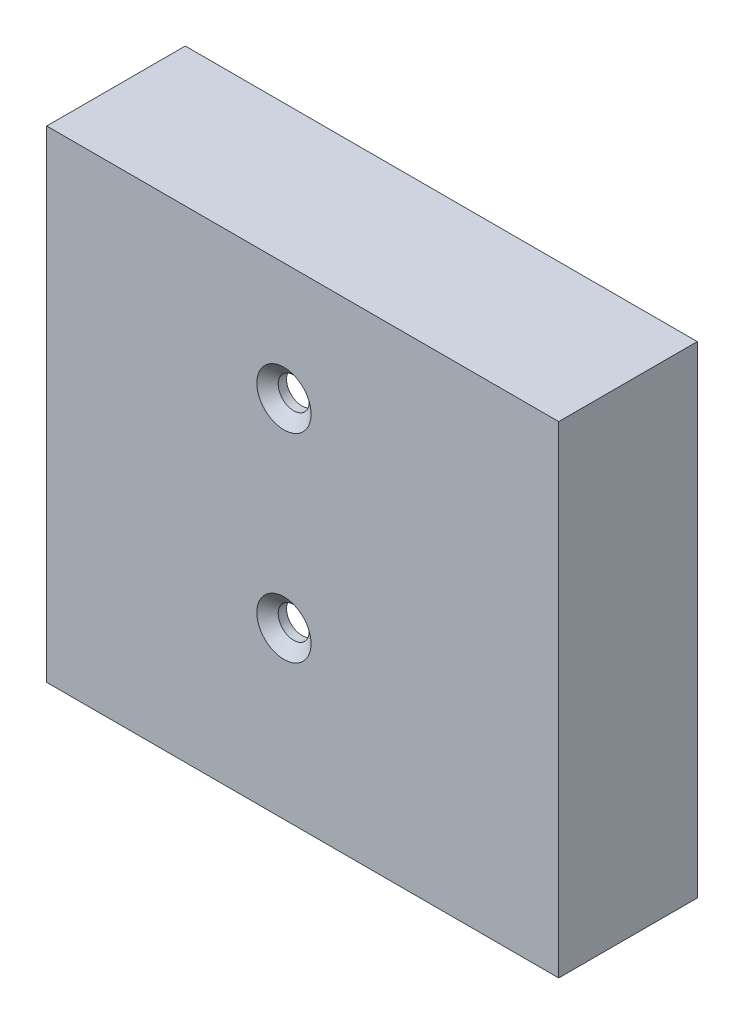
ISO-10303-21;
HEADER;
FILE_DESCRIPTION(('STEP AP214'),'2;1');
FILE_NAME('part.step','',(''),(''),'','','');
FILE_SCHEMA(('AUTOMOTIVE_DESIGN { 1 0 10303 214 1 1 1 1 }'));
ENDSEC;
DATA;
#1=APPLICATION_CONTEXT('core data for automotive mechanical design processes');
#2=APPLICATION_PROTOCOL_DEFINITION('international standard','automotive_design',2000,#1);
#3=PRODUCT_CONTEXT('',#1,'mechanical');
#4=PRODUCT('Part','Part','',(#3));
#5=PRODUCT_RELATED_PRODUCT_CATEGORY('part','',(#4));
#6=PRODUCT_DEFINITION_FORMATION('','',#4);
#7=PRODUCT_DEFINITION_CONTEXT('part definition',#1,'design');
#8=PRODUCT_DEFINITION('design','',#6,#7);
#9=PRODUCT_DEFINITION_SHAPE('','',#8);
#10=(LENGTH_UNIT() NAMED_UNIT(*) SI_UNIT(.MILLI.,.METRE.));
#11=(NAMED_UNIT(*) PLANE_ANGLE_UNIT() SI_UNIT($,.RADIAN.));
#12=(NAMED_UNIT(*) SI_UNIT($,.STERADIAN.) SOLID_ANGLE_UNIT());
#13=UNCERTAINTY_MEASURE_WITH_UNIT(LENGTH_MEASURE(1.E-05),#10,'distance_accuracy_value','');
#14=(GEOMETRIC_REPRESENTATION_CONTEXT(3) GLOBAL_UNCERTAINTY_ASSIGNED_CONTEXT((#13)) GLOBAL_UNIT_ASSIGNED_CONTEXT((#10,
#11,#12)) REPRESENTATION_CONTEXT('',''));
#15=CARTESIAN_POINT('',(0.,0.,0.));
#16=DIRECTION('',(0.,0.,1.));
#17=DIRECTION('',(1.,0.,0.));
#18=AXIS2_PLACEMENT_3D('',#15,#16,#17);
#19=CARTESIAN_POINT('',(-1.5875,0.,-14.2875));
#20=DIRECTION('',(0.,0.,-1.));
#21=DIRECTION('',(-1.,0.,0.));
#22=AXIS2_PLACEMENT_3D('',#19,#20,#21);
#23=PLANE('',#22);
#24=DIRECTION('',(1.,0.,0.));
#25=VECTOR('',#24,1.);
#26=CARTESIAN_POINT('',(-1.5885,43.815,-14.2875));
#27=LINE('',#26,#25);
#28=CARTESIAN_POINT('',(0.,43.815,-14.2875));
#29=VERTEX_POINT('',#28);
#30=CARTESIAN_POINT('',(1.27,43.815,-14.2875));
#31=VERTEX_POINT('',#30);
#32=EDGE_CURVE('E499',#29,#31,#27,.T.);
#33=ORIENTED_EDGE('',*,*,#32,.T.);
#34=DIRECTION('',(0.,-1.,0.));
#35=VECTOR('',#34,1.);
#36=CARTESIAN_POINT('',(1.27,48.26,-14.2875));
#37=LINE('',#36,#35);
#38=CARTESIAN_POINT('',(1.27,27.94,-14.2875));
#39=VERTEX_POINT('',#38);
#40=EDGE_CURVE('E291',#31,#39,#37,.T.);
#41=ORIENTED_EDGE('',*,*,#40,.T.);
#42=DIRECTION('',(1.,0.,0.));
#43=VECTOR('',#42,1.);
#44=CARTESIAN_POINT('',(-1.5885,27.94,-14.2875));
#45=LINE('',#44,#43);
#46=CARTESIAN_POINT('',(0.,27.94,-14.2875));
#47=VERTEX_POINT('',#46);
#48=EDGE_CURVE('E66',#47,#39,#45,.T.);
#49=ORIENTED_EDGE('',*,*,#48,.F.);
#50=DIRECTION('',(0.,-1.,0.));
#51=VECTOR('',#50,1.);
#52=CARTESIAN_POINT('',(0.,48.26,-14.2875));
#53=LINE('',#52,#51);
#54=EDGE_CURVE('E275',#29,#47,#53,.T.);
#55=ORIENTED_EDGE('',*,*,#54,.F.);
#56=EDGE_LOOP('',(#33,#41,#49,#55));
#57=FACE_BOUND('',#56,.T.);
#58=ADVANCED_FACE('F40',(#57),#23,.T.);
#59=DIRECTION('',(1.,0.,0.));
#60=VECTOR('',#59,1.);
#61=CARTESIAN_POINT('',(-1.5885,14.605,-14.2875));
#62=LINE('',#61,#60);
#63=CARTESIAN_POINT('',(0.,14.605,-14.2875));
#64=VERTEX_POINT('',#63);
#65=CARTESIAN_POINT('',(1.27,14.605,-14.2875));
#66=VERTEX_POINT('',#65);
#67=EDGE_CURVE('E250',#64,#66,#62,.T.);
#68=ORIENTED_EDGE('',*,*,#67,.F.);
#69=CARTESIAN_POINT('',(0.,22.86,-14.2875));
#70=VERTEX_POINT('',#69);
#71=EDGE_CURVE('E265',#70,#64,#53,.T.);
#72=ORIENTED_EDGE('',*,*,#71,.F.);
#73=DIRECTION('',(1.,0.,0.));
#74=VECTOR('',#73,1.);
#75=CARTESIAN_POINT('',(-1.5885,22.86,-14.2875));
#76=LINE('',#75,#74);
#77=CARTESIAN_POINT('',(1.27,22.86,-14.2875));
#78=VERTEX_POINT('',#77);
#79=EDGE_CURVE('E521',#70,#78,#76,.T.);
#80=ORIENTED_EDGE('',*,*,#79,.T.);
#81=EDGE_CURVE('E267',#78,#66,#37,.T.);
#82=ORIENTED_EDGE('',*,*,#81,.T.);
#83=EDGE_LOOP('',(#68,#72,#80,#82));
#84=FACE_BOUND('',#83,.T.);
#85=ADVANCED_FACE('F263',(#84),#23,.T.);
#86=DIRECTION('',(1.,0.,0.));
#87=VECTOR('',#86,1.);
#88=CARTESIAN_POINT('',(-1.5885,9.52500000000001,-14.2875));
#89=LINE('',#88,#87);
#90=CARTESIAN_POINT('',(0.,9.52500000000001,-14.2875));
#91=VERTEX_POINT('',#90);
#92=CARTESIAN_POINT('',(1.27,9.52500000000001,-14.2875));
#93=VERTEX_POINT('',#92);
#94=EDGE_CURVE('E269',#91,#93,#89,.T.);
#95=ORIENTED_EDGE('',*,*,#94,.T.);
#96=CARTESIAN_POINT('',(1.27,6.858,-14.2875));
#97=VERTEX_POINT('',#96);
#98=EDGE_CURVE('E287',#93,#97,#37,.T.);
#99=ORIENTED_EDGE('',*,*,#98,.T.);
#100=DIRECTION('',(1.,0.,0.));
#101=VECTOR('',#100,1.);
#102=CARTESIAN_POINT('',(0.,6.858,-14.2875));
#103=LINE('',#102,#101);
#104=CARTESIAN_POINT('',(0.,6.858,-14.2875));
#105=VERTEX_POINT('',#104);
#106=EDGE_CURVE('E292',#105,#97,#103,.T.);
#107=ORIENTED_EDGE('',*,*,#106,.F.);
#108=EDGE_CURVE('E276',#91,#105,#53,.T.);
#109=ORIENTED_EDGE('',*,*,#108,.F.);
#110=EDGE_LOOP('',(#95,#99,#107,#109));
#111=FACE_BOUND('',#110,.T.);
#112=ADVANCED_FACE('F660',(#111),#23,.T.);
#113=CARTESIAN_POINT('',(0.,48.26,-57.2964739477001));
#114=DIRECTION('',(-1.,0.,0.));
#115=DIRECTION('',(0.,-1.,0.));
#116=AXIS2_PLACEMENT_3D('',#113,#114,#115);
#117=PLANE('',#116);
#118=DIRECTION('',(0.,0.,1.));
#119=VECTOR('',#118,1.);
#120=CARTESIAN_POINT('',(0.,14.605,-12.7));
#121=LINE('',#120,#119);
#122=CARTESIAN_POINT('',(0.,14.605,-12.7));
#123=VERTEX_POINT('',#122);
#124=EDGE_CURVE('E246',#64,#123,#121,.T.);
#125=ORIENTED_EDGE('',*,*,#124,.T.);
#126=DIRECTION('',(0.,1.,0.));
#127=VECTOR('',#126,1.);
#128=CARTESIAN_POINT('',(0.,0.,-12.7));
#129=LINE('',#128,#127);
#130=CARTESIAN_POINT('',(0.,22.86,-12.7));
#131=VERTEX_POINT('',#130);
#132=EDGE_CURVE('E309',#123,#131,#129,.T.);
#133=ORIENTED_EDGE('',*,*,#132,.T.);
#134=DIRECTION('',(0.,0.,-1.));
#135=VECTOR('',#134,1.);
#136=CARTESIAN_POINT('',(0.,22.86,-14.2875));
#137=LINE('',#136,#135);
#138=EDGE_CURVE('E273',#131,#70,#137,.T.);
#139=ORIENTED_EDGE('',*,*,#138,.T.);
#140=ORIENTED_EDGE('',*,*,#71,.T.);
#141=EDGE_LOOP('',(#125,#133,#139,#140));
#142=FACE_BOUND('',#141,.T.);
#143=ADVANCED_FACE('F272',(#142),#117,.T.);
#144=DIRECTION('',(0.,0.,-1.));
#145=VECTOR('',#144,1.);
#146=CARTESIAN_POINT('',(0.,9.52500000000001,-12.7));
#147=LINE('',#146,#145);
#148=CARTESIAN_POINT('',(0.,9.52500000000001,-12.7));
#149=VERTEX_POINT('',#148);
#150=EDGE_CURVE('E475',#149,#91,#147,.T.);
#151=ORIENTED_EDGE('',*,*,#150,.T.);
#152=ORIENTED_EDGE('',*,*,#108,.T.);
#153=DIRECTION('',(0.,0.,1.));
#154=VECTOR('',#153,1.);
#155=CARTESIAN_POINT('',(0.,6.858,-57.2964739477001));
#156=LINE('',#155,#154);
#157=CARTESIAN_POINT('',(0.,6.858,-12.7));
#158=VERTEX_POINT('',#157);
#159=EDGE_CURVE('E297',#105,#158,#156,.T.);
#160=ORIENTED_EDGE('',*,*,#159,.T.);
#161=EDGE_CURVE('E304',#158,#149,#129,.T.);
#162=ORIENTED_EDGE('',*,*,#161,.T.);
#163=EDGE_LOOP('',(#151,#152,#160,#162));
#164=FACE_BOUND('',#163,.T.);
#165=ADVANCED_FACE('F665',(#164),#117,.T.);
#166=CARTESIAN_POINT('',(-1.5875,0.,-12.7));
#167=DIRECTION('',(0.,0.,-1.));
#168=DIRECTION('',(-1.,0.,0.));
#169=AXIS2_PLACEMENT_3D('',#166,#167,#168);
#170=PLANE('',#169);
#171=DIRECTION('',(1.,0.,0.));
#172=VECTOR('',#171,1.);
#173=CARTESIAN_POINT('',(0.,48.895,-12.7));
#174=LINE('',#173,#172);
#175=CARTESIAN_POINT('',(1.27,48.895,-12.7));
#176=VERTEX_POINT('',#175);
#177=CARTESIAN_POINT('',(50.4825,48.895,-12.7));
#178=VERTEX_POINT('',#177);
#179=EDGE_CURVE('E536',#176,#178,#174,.T.);
#180=ORIENTED_EDGE('',*,*,#179,.F.);
#181=DIRECTION('',(0.,-1.,0.));
#182=VECTOR('',#181,1.);
#183=CARTESIAN_POINT('',(1.27,48.895,-12.7));
#184=LINE('',#183,#182);
#185=CARTESIAN_POINT('',(1.27,48.26,-12.7));
#186=VERTEX_POINT('',#185);
#187=EDGE_CURVE('E453',#176,#186,#184,.T.);
#188=ORIENTED_EDGE('',*,*,#187,.T.);
#189=CARTESIAN_POINT('',(1.27,43.815,-12.7));
#190=VERTEX_POINT('',#189);
#191=EDGE_CURVE('E447',#186,#190,#184,.T.);
#192=ORIENTED_EDGE('',*,*,#191,.T.);
#193=DIRECTION('',(1.,0.,0.));
#194=VECTOR('',#193,1.);
#195=CARTESIAN_POINT('',(-1.5885,43.815,-12.7));
#196=LINE('',#195,#194);
#197=CARTESIAN_POINT('',(0.,43.815,-12.7));
#198=VERTEX_POINT('',#197);
#199=EDGE_CURVE('E498',#198,#190,#196,.T.);
#200=ORIENTED_EDGE('',*,*,#199,.F.);
#201=CARTESIAN_POINT('',(0.,27.94,-12.7));
#202=VERTEX_POINT('',#201);
#203=EDGE_CURVE('E310',#202,#198,#129,.T.);
#204=ORIENTED_EDGE('',*,*,#203,.F.);
#205=DIRECTION('',(1.,0.,0.));
#206=VECTOR('',#205,1.);
#207=CARTESIAN_POINT('',(-1.5885,27.94,-12.7));
#208=LINE('',#207,#206);
#209=CARTESIAN_POINT('',(1.27,27.94,-12.7));
#210=VERTEX_POINT('',#209);
#211=EDGE_CURVE('E528',#202,#210,#208,.T.);
#212=ORIENTED_EDGE('',*,*,#211,.T.);
#213=DIRECTION('',(0.,-1.,0.));
#214=VECTOR('',#213,1.);
#215=CARTESIAN_POINT('',(1.27,27.94,-12.7));
#216=LINE('',#215,#214);
#217=CARTESIAN_POINT('',(1.27,22.86,-12.7));
#218=VERTEX_POINT('',#217);
#219=EDGE_CURVE('E514',#210,#218,#216,.T.);
#220=ORIENTED_EDGE('',*,*,#219,.T.);
#221=DIRECTION('',(1.,0.,0.));
#222=VECTOR('',#221,1.);
#223=CARTESIAN_POINT('',(-1.5885,22.86,-12.7));
#224=LINE('',#223,#222);
#225=EDGE_CURVE('E525',#131,#218,#224,.T.);
#226=ORIENTED_EDGE('',*,*,#225,.F.);
#227=ORIENTED_EDGE('',*,*,#132,.F.);
#228=DIRECTION('',(1.,0.,0.));
#229=VECTOR('',#228,1.);
#230=CARTESIAN_POINT('',(-1.5885,14.605,-12.7));
#231=LINE('',#230,#229);
#232=CARTESIAN_POINT('',(1.27,14.605,-12.7));
#233=VERTEX_POINT('',#232);
#234=EDGE_CURVE('E252',#123,#233,#231,.T.);
#235=ORIENTED_EDGE('',*,*,#234,.T.);
#236=DIRECTION('',(0.,-1.,0.));
#237=VECTOR('',#236,1.);
#238=CARTESIAN_POINT('',(1.27,14.605,-12.7));
#239=LINE('',#238,#237);
#240=CARTESIAN_POINT('',(1.27,9.52500000000001,-12.7));
#241=VERTEX_POINT('',#240);
#242=EDGE_CURVE('E58',#233,#241,#239,.T.);
#243=ORIENTED_EDGE('',*,*,#242,.T.);
#244=DIRECTION('',(1.,0.,0.));
#245=VECTOR('',#244,1.);
#246=CARTESIAN_POINT('',(-1.5885,9.52500000000001,-12.7));
#247=LINE('',#246,#245);
#248=EDGE_CURVE('E473',#149,#241,#247,.T.);
#249=ORIENTED_EDGE('',*,*,#248,.F.);
#250=ORIENTED_EDGE('',*,*,#161,.F.);
#251=DIRECTION('',(0.,1.,0.));
#252=VECTOR('',#251,1.);
#253=CARTESIAN_POINT('',(0.,0.,-12.7));
#254=LINE('',#253,#252);
#255=CARTESIAN_POINT('',(0.,0.,-12.7));
#256=VERTEX_POINT('',#255);
#257=EDGE_CURVE('E392',#256,#158,#254,.T.);
#258=ORIENTED_EDGE('',*,*,#257,.F.);
#259=DIRECTION('',(1.,0.,0.));
#260=VECTOR('',#259,1.);
#261=CARTESIAN_POINT('',(-1.5875,0.,-12.7));
#262=LINE('',#261,#260);
#263=CARTESIAN_POINT('',(-1.5875,0.,-12.7));
#264=VERTEX_POINT('',#263);
#265=EDGE_CURVE('E418',#264,#256,#262,.T.);
#266=ORIENTED_EDGE('',*,*,#265,.F.);
#267=DIRECTION('',(0.,1.,0.));
#268=VECTOR('',#267,1.);
#269=CARTESIAN_POINT('',(-1.5875,0.,-12.7));
#270=LINE('',#269,#268);
#271=CARTESIAN_POINT('',(-1.5875,50.8,-12.7));
#272=VERTEX_POINT('',#271);
#273=EDGE_CURVE('E406',#264,#272,#270,.T.);
#274=ORIENTED_EDGE('',*,*,#273,.T.);
#275=DIRECTION('',(1.,0.,0.));
#276=VECTOR('',#275,1.);
#277=CARTESIAN_POINT('',(-1.5875,50.8,-12.7));
#278=LINE('',#277,#276);
#279=CARTESIAN_POINT('',(52.3875,50.8,-12.7));
#280=VERTEX_POINT('',#279);
#281=EDGE_CURVE('E422',#272,#280,#278,.T.);
#282=ORIENTED_EDGE('',*,*,#281,.T.);
#283=DIRECTION('',(0.,-1.,0.));
#284=VECTOR('',#283,1.);
#285=CARTESIAN_POINT('',(52.3875,50.8,-12.7));
#286=LINE('',#285,#284);
#287=CARTESIAN_POINT('',(52.3875,0.,-12.7));
#288=VERTEX_POINT('',#287);
#289=EDGE_CURVE('E380',#280,#288,#286,.T.);
#290=ORIENTED_EDGE('',*,*,#289,.T.);
#291=CARTESIAN_POINT('',(24.257,0.,-12.7));
#292=VERTEX_POINT('',#291);
#293=EDGE_CURVE('E414',#292,#288,#262,.T.);
#294=ORIENTED_EDGE('',*,*,#293,.F.);
#295=DIRECTION('',(0.,-1.,0.));
#296=VECTOR('',#295,1.);
#297=CARTESIAN_POINT('',(24.257,50.801,-12.7));
#298=LINE('',#297,#296);
#299=CARTESIAN_POINT('',(24.257,1.905,-12.7));
#300=VERTEX_POINT('',#299);
#301=EDGE_CURVE('E355',#300,#292,#298,.T.);
#302=ORIENTED_EDGE('',*,*,#301,.F.);
#303=DIRECTION('',(-1.,0.,0.));
#304=VECTOR('',#303,1.);
#305=CARTESIAN_POINT('',(50.4825,1.905,-12.7));
#306=LINE('',#305,#304);
#307=CARTESIAN_POINT('',(50.4825,1.905,-12.7));
#308=VERTEX_POINT('',#307);
#309=EDGE_CURVE('E537',#308,#300,#306,.T.);
#310=ORIENTED_EDGE('',*,*,#309,.F.);
#311=DIRECTION('',(0.,-1.,0.));
#312=VECTOR('',#311,1.);
#313=CARTESIAN_POINT('',(50.4825,48.895,-12.7));
#314=LINE('',#313,#312);
#315=EDGE_CURVE('E543',#178,#308,#314,.T.);
#316=ORIENTED_EDGE('',*,*,#315,.F.);
#317=EDGE_LOOP('',(#180,#188,#192,#200,#204,#212,#220,#226,#227,#235,#243,#249,#250,#258,#266,
#274,#282,#290,#294,#302,#310,#316));
#318=FACE_BOUND('',#317,.T.);
#319=ADVANCED_FACE('F606',(#318),#170,.T.);
#320=CARTESIAN_POINT('',(49.8475,48.26,-85.6732153344636));
#321=DIRECTION('',(0.,1.,0.));
#322=DIRECTION('',(0.,0.,1.));
#323=AXIS2_PLACEMENT_3D('',#320,#321,#322);
#324=PLANE('',#323);
#325=DIRECTION('',(0.,0.,1.));
#326=VECTOR('',#325,1.);
#327=CARTESIAN_POINT('',(1.27,48.26,-85.6732153344636));
#328=LINE('',#327,#326);
#329=CARTESIAN_POINT('',(1.27,48.26,-14.2875));
#330=VERTEX_POINT('',#329);
#331=EDGE_CURVE('E12',#330,#186,#328,.T.);
#332=ORIENTED_EDGE('',*,*,#331,.F.);
#333=DIRECTION('',(-1.,0.,0.));
#334=VECTOR('',#333,1.);
#335=CARTESIAN_POINT('',(49.8475,48.26,-14.2875));
#336=LINE('',#335,#334);
#337=CARTESIAN_POINT('',(49.8475,48.26,-14.2875));
#338=VERTEX_POINT('',#337);
#339=EDGE_CURVE('E568',#338,#330,#336,.T.);
#340=ORIENTED_EDGE('',*,*,#339,.F.);
#341=DIRECTION('',(0.,0.,1.));
#342=VECTOR('',#341,1.);
#343=CARTESIAN_POINT('',(49.8475,48.26,-85.6732153344636));
#344=LINE('',#343,#342);
#345=CARTESIAN_POINT('',(49.8475,48.26,0.));
#346=VERTEX_POINT('',#345);
#347=EDGE_CURVE('E381',#338,#346,#344,.T.);
#348=ORIENTED_EDGE('',*,*,#347,.T.);
#349=DIRECTION('',(-1.,0.,0.));
#350=VECTOR('',#349,1.);
#351=CARTESIAN_POINT('',(49.8475,48.26,0.));
#352=LINE('',#351,#350);
#353=CARTESIAN_POINT('',(1.27,48.26,0.));
#354=VERTEX_POINT('',#353);
#355=EDGE_CURVE('E376',#346,#354,#352,.T.);
#356=ORIENTED_EDGE('',*,*,#355,.T.);
#357=EDGE_CURVE('E50',#186,#354,#328,.T.);
#358=ORIENTED_EDGE('',*,*,#357,.F.);
#359=EDGE_LOOP('',(#332,#340,#348,#356,#358));
#360=FACE_BOUND('',#359,.T.);
#361=ADVANCED_FACE('F620',(#360),#324,.F.);
#362=CARTESIAN_POINT('',(0.,0.,0.));
#363=DIRECTION('',(0.,0.,-1.));
#364=DIRECTION('',(-1.,0.,0.));
#365=AXIS2_PLACEMENT_3D('',#362,#363,#364);
#366=PLANE('',#365);
#367=CARTESIAN_POINT('',(23.4188,38.4175,0.));
#368=DIRECTION('',(0.,0.,-1.));
#369=DIRECTION('',(-1.,0.,0.));
#370=AXIS2_PLACEMENT_3D('',#367,#368,#369);
#371=CIRCLE('',#370,1.63195);
#372=CARTESIAN_POINT('',(21.78685,38.4175,0.));
#373=VERTEX_POINT('',#372);
#374=EDGE_CURVE('E44',#373,#373,#371,.T.);
#375=ORIENTED_EDGE('',*,*,#374,.F.);
#376=EDGE_LOOP('',(#375));
#377=FACE_BOUND('',#376,.T.);
#378=CARTESIAN_POINT('',(23.4188,17.4625,0.));
#379=DIRECTION('',(0.,0.,-1.));
#380=DIRECTION('',(-1.,0.,0.));
#381=AXIS2_PLACEMENT_3D('',#378,#379,#380);
#382=CIRCLE('',#381,1.63195);
#383=CARTESIAN_POINT('',(21.78685,17.4625,0.));
#384=VERTEX_POINT('',#383);
#385=EDGE_CURVE('E444',#384,#384,#382,.T.);
#386=ORIENTED_EDGE('',*,*,#385,.F.);
#387=EDGE_LOOP('',(#386));
#388=FACE_BOUND('',#387,.T.);
#389=DIRECTION('',(1.,0.,0.));
#390=VECTOR('',#389,1.);
#391=CARTESIAN_POINT('',(0.,6.858,0.));
#392=LINE('',#391,#390);
#393=CARTESIAN_POINT('',(0.,6.858,0.));
#394=VERTEX_POINT('',#393);
#395=CARTESIAN_POINT('',(1.27,6.858,0.));
#396=VERTEX_POINT('',#395);
#397=EDGE_CURVE('E282',#394,#396,#392,.T.);
#398=ORIENTED_EDGE('',*,*,#397,.T.);
#399=DIRECTION('',(0.,-1.,0.));
#400=VECTOR('',#399,1.);
#401=CARTESIAN_POINT('',(1.27,48.26,0.));
#402=LINE('',#401,#400);
#403=EDGE_CURVE('E285',#354,#396,#402,.T.);
#404=ORIENTED_EDGE('',*,*,#403,.F.);
#405=ORIENTED_EDGE('',*,*,#355,.F.);
#406=DIRECTION('',(0.,1.,0.));
#407=VECTOR('',#406,1.);
#408=CARTESIAN_POINT('',(49.8475,2.53999999999999,0.));
#409=LINE('',#408,#407);
#410=CARTESIAN_POINT('',(49.8475,2.53999999999999,0.));
#411=VERTEX_POINT('',#410);
#412=EDGE_CURVE('E382',#411,#346,#409,.T.);
#413=ORIENTED_EDGE('',*,*,#412,.F.);
#414=DIRECTION('',(1.,0.,0.));
#415=VECTOR('',#414,1.);
#416=CARTESIAN_POINT('',(0.,2.54,0.));
#417=LINE('',#416,#415);
#418=CARTESIAN_POINT('',(24.257,2.53999999999999,0.));
#419=VERTEX_POINT('',#418);
#420=EDGE_CURVE('E375',#419,#411,#417,.T.);
#421=ORIENTED_EDGE('',*,*,#420,.F.);
#422=DIRECTION('',(0.,-1.,0.));
#423=VECTOR('',#422,1.);
#424=CARTESIAN_POINT('',(24.257,50.801,0.));
#425=LINE('',#424,#423);
#426=CARTESIAN_POINT('',(24.257,0.,0.));
#427=VERTEX_POINT('',#426);
#428=EDGE_CURVE('E360',#419,#427,#425,.T.);
#429=ORIENTED_EDGE('',*,*,#428,.T.);
#430=DIRECTION('',(-1.,0.,0.));
#431=VECTOR('',#430,1.);
#432=CARTESIAN_POINT('',(17.145,0.,0.));
#433=LINE('',#432,#431);
#434=CARTESIAN_POINT('',(17.145,0.,0.));
#435=VERTEX_POINT('',#434);
#436=EDGE_CURVE('E344',#427,#435,#433,.T.);
#437=ORIENTED_EDGE('',*,*,#436,.T.);
#438=DIRECTION('',(0.,-1.,0.));
#439=VECTOR('',#438,1.);
#440=CARTESIAN_POINT('',(17.145,50.801,0.));
#441=LINE('',#440,#439);
#442=CARTESIAN_POINT('',(17.145,5.08,0.));
#443=VERTEX_POINT('',#442);
#444=EDGE_CURVE('E320',#443,#435,#441,.T.);
#445=ORIENTED_EDGE('',*,*,#444,.F.);
#446=DIRECTION('',(1.,0.,0.));
#447=VECTOR('',#446,1.);
#448=CARTESIAN_POINT('',(17.145,5.08,0.));
#449=LINE('',#448,#447);
#450=CARTESIAN_POINT('',(6.985,5.08,0.));
#451=VERTEX_POINT('',#450);
#452=EDGE_CURVE('E311',#451,#443,#449,.T.);
#453=ORIENTED_EDGE('',*,*,#452,.F.);
#454=DIRECTION('',(0.,-1.,0.));
#455=VECTOR('',#454,1.);
#456=CARTESIAN_POINT('',(6.985,50.801,0.));
#457=LINE('',#456,#455);
#458=CARTESIAN_POINT('',(6.985,0.,0.));
#459=VERTEX_POINT('',#458);
#460=EDGE_CURVE('E339',#451,#459,#457,.T.);
#461=ORIENTED_EDGE('',*,*,#460,.T.);
#462=DIRECTION('',(-1.,0.,0.));
#463=VECTOR('',#462,1.);
#464=CARTESIAN_POINT('',(6.985,0.,0.));
#465=LINE('',#464,#463);
#466=CARTESIAN_POINT('',(0.,0.,0.));
#467=VERTEX_POINT('',#466);
#468=EDGE_CURVE('E332',#459,#467,#465,.T.);
#469=ORIENTED_EDGE('',*,*,#468,.T.);
#470=DIRECTION('',(0.,-1.,0.));
#471=VECTOR('',#470,1.);
#472=CARTESIAN_POINT('',(0.,0.,0.));
#473=LINE('',#472,#471);
#474=EDGE_CURVE('E426',#394,#467,#473,.T.);
#475=ORIENTED_EDGE('',*,*,#474,.F.);
#476=EDGE_LOOP('',(#398,#404,#405,#413,#421,#429,#437,#445,#453,#461,#469,#475));
#477=FACE_BOUND('',#476,.T.);
#478=ADVANCED_FACE('F614',(#377,#388,#477),#366,.T.);
#479=CARTESIAN_POINT('',(0.,0.,1.905));
#480=DIRECTION('',(0.,1.,0.));
#481=DIRECTION('',(0.,0.,1.));
#482=AXIS2_PLACEMENT_3D('',#479,#480,#481);
#483=PLANE('',#482);
#484=ORIENTED_EDGE('',*,*,#468,.F.);
#485=DIRECTION('',(0.,0.,1.));
#486=VECTOR('',#485,1.);
#487=CARTESIAN_POINT('',(6.985,0.,-12.7));
#488=LINE('',#487,#486);
#489=CARTESIAN_POINT('',(6.985,0.,-8.8392));
#490=VERTEX_POINT('',#489);
#491=EDGE_CURVE('E336',#490,#459,#488,.T.);
#492=ORIENTED_EDGE('',*,*,#491,.F.);
#493=DIRECTION('',(1.,0.,0.));
#494=VECTOR('',#493,1.);
#495=CARTESIAN_POINT('',(6.985,0.,-8.8392));
#496=LINE('',#495,#494);
#497=CARTESIAN_POINT('',(17.145,0.,-8.8392));
#498=VERTEX_POINT('',#497);
#499=EDGE_CURVE('E331',#490,#498,#496,.T.);
#500=ORIENTED_EDGE('',*,*,#499,.T.);
#501=DIRECTION('',(0.,0.,-1.));
#502=VECTOR('',#501,1.);
#503=CARTESIAN_POINT('',(17.145,0.,-12.7));
#504=LINE('',#503,#502);
#505=EDGE_CURVE('E352',#435,#498,#504,.T.);
#506=ORIENTED_EDGE('',*,*,#505,.F.);
#507=ORIENTED_EDGE('',*,*,#436,.F.);
#508=DIRECTION('',(0.,0.,1.));
#509=VECTOR('',#508,1.);
#510=CARTESIAN_POINT('',(24.257,0.,-12.7));
#511=LINE('',#510,#509);
#512=EDGE_CURVE('E348',#292,#427,#511,.T.);
#513=ORIENTED_EDGE('',*,*,#512,.F.);
#514=ORIENTED_EDGE('',*,*,#293,.T.);
#515=DIRECTION('',(0.,0.,-1.));
#516=VECTOR('',#515,1.);
#517=CARTESIAN_POINT('',(52.3875,0.,1.905));
#518=LINE('',#517,#516);
#519=CARTESIAN_POINT('',(52.3875,0.,1.905));
#520=VERTEX_POINT('',#519);
#521=EDGE_CURVE('E441',#520,#288,#518,.T.);
#522=ORIENTED_EDGE('',*,*,#521,.F.);
#523=DIRECTION('',(1.,0.,0.));
#524=VECTOR('',#523,1.);
#525=CARTESIAN_POINT('',(0.,0.,1.905));
#526=LINE('',#525,#524);
#527=CARTESIAN_POINT('',(-1.5875,0.,1.905));
#528=VERTEX_POINT('',#527);
#529=EDGE_CURVE('E427',#528,#520,#526,.T.);
#530=ORIENTED_EDGE('',*,*,#529,.F.);
#531=DIRECTION('',(0.,0.,-1.));
#532=VECTOR('',#531,1.);
#533=CARTESIAN_POINT('',(-1.5875,0.,1.905));
#534=LINE('',#533,#532);
#535=EDGE_CURVE('E410',#528,#264,#534,.T.);
#536=ORIENTED_EDGE('',*,*,#535,.T.);
#537=ORIENTED_EDGE('',*,*,#265,.T.);
#538=DIRECTION('',(0.,0.,-1.));
#539=VECTOR('',#538,1.);
#540=CARTESIAN_POINT('',(0.,0.,-12.7));
#541=LINE('',#540,#539);
#542=EDGE_CURVE('E327',#467,#256,#541,.T.);
#543=ORIENTED_EDGE('',*,*,#542,.F.);
#544=EDGE_LOOP('',(#484,#492,#500,#506,#507,#513,#514,#522,#530,#536,#537,#543));
#545=FACE_BOUND('',#544,.T.);
#546=ADVANCED_FACE('F42',(#545),#483,.F.);
#547=CARTESIAN_POINT('',(0.,2.54,-85.6732153344636));
#548=DIRECTION('',(0.,-1.,0.));
#549=DIRECTION('',(1.,0.,0.));
#550=AXIS2_PLACEMENT_3D('',#547,#548,#549);
#551=PLANE('',#550);
#552=DIRECTION('',(0.,0.,1.));
#553=VECTOR('',#552,1.);
#554=CARTESIAN_POINT('',(49.8475,2.53999999999999,-85.6732153344636));
#555=LINE('',#554,#553);
#556=CARTESIAN_POINT('',(49.8475,2.53999999999999,-14.2875));
#557=VERTEX_POINT('',#556);
#558=EDGE_CURVE('E386',#557,#411,#555,.T.);
#559=ORIENTED_EDGE('',*,*,#558,.F.);
#560=DIRECTION('',(1.,0.,0.));
#561=VECTOR('',#560,1.);
#562=CARTESIAN_POINT('',(24.257,2.53999999999999,-14.2875));
#563=LINE('',#562,#561);
#564=CARTESIAN_POINT('',(24.257,2.53999999999999,-14.2875));
#565=VERTEX_POINT('',#564);
#566=EDGE_CURVE('E290',#565,#557,#563,.T.);
#567=ORIENTED_EDGE('',*,*,#566,.F.);
#568=DIRECTION('',(0.,0.,-1.));
#569=VECTOR('',#568,1.);
#570=CARTESIAN_POINT('',(24.257,2.54,-12.7));
#571=LINE('',#570,#569);
#572=EDGE_CURVE('E343',#419,#565,#571,.T.);
#573=ORIENTED_EDGE('',*,*,#572,.F.);
#574=ORIENTED_EDGE('',*,*,#420,.T.);
#575=EDGE_LOOP('',(#559,#567,#573,#574));
#576=FACE_BOUND('',#575,.T.);
#577=ADVANCED_FACE('F626',(#576),#551,.F.);
#578=CARTESIAN_POINT('',(0.,0.,0.));
#579=DIRECTION('',(-1.,0.,0.));
#580=DIRECTION('',(0.,0.,1.));
#581=AXIS2_PLACEMENT_3D('',#578,#579,#580);
#582=PLANE('',#581);
#583=ORIENTED_EDGE('',*,*,#257,.T.);
#584=EDGE_CURVE('E281',#158,#394,#156,.T.);
#585=ORIENTED_EDGE('',*,*,#584,.T.);
#586=ORIENTED_EDGE('',*,*,#474,.T.);
#587=ORIENTED_EDGE('',*,*,#542,.T.);
#588=EDGE_LOOP('',(#583,#585,#586,#587));
#589=FACE_BOUND('',#588,.T.);
#590=ADVANCED_FACE('F652',(#589),#582,.F.);
#591=CARTESIAN_POINT('',(52.3875,0.,1.905));
#592=DIRECTION('',(-1.,0.,0.));
#593=DIRECTION('',(0.,0.,1.));
#594=AXIS2_PLACEMENT_3D('',#591,#592,#593);
#595=PLANE('',#594);
#596=ORIENTED_EDGE('',*,*,#521,.T.);
#597=ORIENTED_EDGE('',*,*,#289,.F.);
#598=DIRECTION('',(0.,0.,-1.));
#599=VECTOR('',#598,1.);
#600=CARTESIAN_POINT('',(52.3875,50.8,1.905));
#601=LINE('',#600,#599);
#602=CARTESIAN_POINT('',(52.3875,50.8,1.905));
#603=VERTEX_POINT('',#602);
#604=EDGE_CURVE('E436',#603,#280,#601,.T.);
#605=ORIENTED_EDGE('',*,*,#604,.F.);
#606=DIRECTION('',(0.,1.,0.));
#607=VECTOR('',#606,1.);
#608=CARTESIAN_POINT('',(52.3875,0.,1.905));
#609=LINE('',#608,#607);
#610=EDGE_CURVE('E430',#520,#603,#609,.T.);
#611=ORIENTED_EDGE('',*,*,#610,.F.);
#612=EDGE_LOOP('',(#596,#597,#605,#611));
#613=FACE_BOUND('',#612,.T.);
#614=ADVANCED_FACE('F1023',(#613),#595,.F.);
#615=CARTESIAN_POINT('',(0.,50.8,1.905));
#616=DIRECTION('',(0.,-1.,0.));
#617=DIRECTION('',(0.,0.,-1.));
#618=AXIS2_PLACEMENT_3D('',#615,#616,#617);
#619=PLANE('',#618);
#620=ORIENTED_EDGE('',*,*,#604,.T.);
#621=ORIENTED_EDGE('',*,*,#281,.F.);
#622=DIRECTION('',(0.,0.,-1.));
#623=VECTOR('',#622,1.);
#624=CARTESIAN_POINT('',(-1.5875,50.8,1.905));
#625=LINE('',#624,#623);
#626=CARTESIAN_POINT('',(-1.5875,50.8,1.905));
#627=VERTEX_POINT('',#626);
#628=EDGE_CURVE('E403',#627,#272,#625,.T.);
#629=ORIENTED_EDGE('',*,*,#628,.F.);
#630=DIRECTION('',(-1.,0.,0.));
#631=VECTOR('',#630,1.);
#632=CARTESIAN_POINT('',(0.,50.8,1.905));
#633=LINE('',#632,#631);
#634=EDGE_CURVE('E433',#603,#627,#633,.T.);
#635=ORIENTED_EDGE('',*,*,#634,.F.);
#636=EDGE_LOOP('',(#620,#621,#629,#635));
#637=FACE_BOUND('',#636,.T.);
#638=ADVANCED_FACE('F841',(#637),#619,.F.);
#639=CARTESIAN_POINT('',(0.,0.,1.905));
#640=DIRECTION('',(0.,0.,-1.));
#641=DIRECTION('',(-1.,0.,0.));
#642=AXIS2_PLACEMENT_3D('',#639,#640,#641);
#643=PLANE('',#642);
#644=CARTESIAN_POINT('',(23.4188,38.4175,1.905));
#645=DIRECTION('',(0.,0.,1.));
#646=DIRECTION('',(1.,0.,0.));
#647=AXIS2_PLACEMENT_3D('',#644,#645,#646);
#648=CIRCLE('',#647,2.8575);
#649=CARTESIAN_POINT('',(26.2763,38.4175,1.905));
#650=VERTEX_POINT('',#649);
#651=EDGE_CURVE('E1099',#650,#650,#648,.T.);
#652=ORIENTED_EDGE('',*,*,#651,.F.);
#653=EDGE_LOOP('',(#652));
#654=FACE_BOUND('',#653,.T.);
#655=CARTESIAN_POINT('',(23.4188,17.4625,1.905));
#656=DIRECTION('',(0.,0.,1.));
#657=DIRECTION('',(1.,0.,0.));
#658=AXIS2_PLACEMENT_3D('',#655,#656,#657);
#659=CIRCLE('',#658,2.8575);
#660=CARTESIAN_POINT('',(26.2763,17.4625,1.905));
#661=VERTEX_POINT('',#660);
#662=EDGE_CURVE('E456',#661,#661,#659,.T.);
#663=ORIENTED_EDGE('',*,*,#662,.F.);
#664=EDGE_LOOP('',(#663));
#665=FACE_BOUND('',#664,.T.);
#666=ORIENTED_EDGE('',*,*,#634,.T.);
#667=DIRECTION('',(0.,1.,0.));
#668=VECTOR('',#667,1.);
#669=CARTESIAN_POINT('',(-1.5875,0.,1.905));
#670=LINE('',#669,#668);
#671=EDGE_CURVE('E399',#528,#627,#670,.T.);
#672=ORIENTED_EDGE('',*,*,#671,.F.);
#673=ORIENTED_EDGE('',*,*,#529,.T.);
#674=ORIENTED_EDGE('',*,*,#610,.T.);
#675=EDGE_LOOP('',(#666,#672,#673,#674));
#676=FACE_BOUND('',#675,.T.);
#677=ADVANCED_FACE('F835',(#654,#665,#676),#643,.F.);
#678=CARTESIAN_POINT('',(-1.5875,0.,0.));
#679=DIRECTION('',(-1.,0.,0.));
#680=DIRECTION('',(0.,0.,1.));
#681=AXIS2_PLACEMENT_3D('',#678,#679,#680);
#682=PLANE('',#681);
#683=ORIENTED_EDGE('',*,*,#671,.T.);
#684=ORIENTED_EDGE('',*,*,#628,.T.);
#685=ORIENTED_EDGE('',*,*,#273,.F.);
#686=ORIENTED_EDGE('',*,*,#535,.F.);
#687=EDGE_LOOP('',(#683,#684,#685,#686));
#688=FACE_BOUND('',#687,.T.);
#689=ADVANCED_FACE('F840',(#688),#682,.T.);
#690=CARTESIAN_POINT('',(49.8475,2.53999999999999,-85.6732153344636));
#691=DIRECTION('',(1.,0.,0.));
#692=DIRECTION('',(0.,0.,-1.));
#693=AXIS2_PLACEMENT_3D('',#690,#691,#692);
#694=PLANE('',#693);
#695=ORIENTED_EDGE('',*,*,#347,.F.);
#696=DIRECTION('',(0.,1.,0.));
#697=VECTOR('',#696,1.);
#698=CARTESIAN_POINT('',(49.8475,2.53999999999999,-14.2875));
#699=LINE('',#698,#697);
#700=EDGE_CURVE('E572',#557,#338,#699,.T.);
#701=ORIENTED_EDGE('',*,*,#700,.F.);
#702=ORIENTED_EDGE('',*,*,#558,.T.);
#703=ORIENTED_EDGE('',*,*,#412,.T.);
#704=EDGE_LOOP('',(#695,#701,#702,#703));
#705=FACE_BOUND('',#704,.T.);
#706=ADVANCED_FACE('F623',(#705),#694,.F.);
#707=CARTESIAN_POINT('',(6.985,50.801,-8.8392));
#708=DIRECTION('',(0.,0.,-1.));
#709=DIRECTION('',(-1.,0.,0.));
#710=AXIS2_PLACEMENT_3D('',#707,#708,#709);
#711=PLANE('',#710);
#712=DIRECTION('',(0.,-1.,0.));
#713=VECTOR('',#712,1.);
#714=CARTESIAN_POINT('',(17.145,50.801,-8.8392));
#715=LINE('',#714,#713);
#716=CARTESIAN_POINT('',(17.145,5.08,-8.8392));
#717=VERTEX_POINT('',#716);
#718=EDGE_CURVE('E368',#717,#498,#715,.T.);
#719=ORIENTED_EDGE('',*,*,#718,.T.);
#720=ORIENTED_EDGE('',*,*,#499,.F.);
#721=DIRECTION('',(0.,-1.,0.));
#722=VECTOR('',#721,1.);
#723=CARTESIAN_POINT('',(6.985,50.801,-8.8392));
#724=LINE('',#723,#722);
#725=CARTESIAN_POINT('',(6.985,5.08,-8.8392));
#726=VERTEX_POINT('',#725);
#727=EDGE_CURVE('E372',#726,#490,#724,.T.);
#728=ORIENTED_EDGE('',*,*,#727,.F.);
#729=DIRECTION('',(1.,0.,0.));
#730=VECTOR('',#729,1.);
#731=CARTESIAN_POINT('',(17.145,5.08,-8.8392));
#732=LINE('',#731,#730);
#733=EDGE_CURVE('E315',#726,#717,#732,.T.);
#734=ORIENTED_EDGE('',*,*,#733,.T.);
#735=EDGE_LOOP('',(#719,#720,#728,#734));
#736=FACE_BOUND('',#735,.T.);
#737=ADVANCED_FACE('F643',(#736),#711,.T.);
#738=CARTESIAN_POINT('',(17.145,50.801,-12.7));
#739=DIRECTION('',(-1.,0.,0.));
#740=DIRECTION('',(0.,0.,1.));
#741=AXIS2_PLACEMENT_3D('',#738,#739,#740);
#742=PLANE('',#741);
#743=ORIENTED_EDGE('',*,*,#718,.F.);
#744=DIRECTION('',(0.,0.,1.));
#745=VECTOR('',#744,1.);
#746=CARTESIAN_POINT('',(17.145,5.08,-19.3118882890689));
#747=LINE('',#746,#745);
#748=EDGE_CURVE('E308',#717,#443,#747,.T.);
#749=ORIENTED_EDGE('',*,*,#748,.T.);
#750=ORIENTED_EDGE('',*,*,#444,.T.);
#751=ORIENTED_EDGE('',*,*,#505,.T.);
#752=EDGE_LOOP('',(#743,#749,#750,#751));
#753=FACE_BOUND('',#752,.T.);
#754=ADVANCED_FACE('F640',(#753),#742,.F.);
#755=CARTESIAN_POINT('',(24.257,50.801,-12.7));
#756=DIRECTION('',(1.,0.,0.));
#757=DIRECTION('',(0.,0.,-1.));
#758=AXIS2_PLACEMENT_3D('',#755,#756,#757);
#759=PLANE('',#758);
#760=ORIENTED_EDGE('',*,*,#572,.T.);
#761=DIRECTION('',(0.,1.,0.));
#762=VECTOR('',#761,1.);
#763=CARTESIAN_POINT('',(24.257,1.905,-14.2875));
#764=LINE('',#763,#762);
#765=CARTESIAN_POINT('',(24.257,1.905,-14.2875));
#766=VERTEX_POINT('',#765);
#767=EDGE_CURVE('E553',#766,#565,#764,.T.);
#768=ORIENTED_EDGE('',*,*,#767,.F.);
#769=DIRECTION('',(0.,0.,1.));
#770=VECTOR('',#769,1.);
#771=CARTESIAN_POINT('',(24.257,1.905,-83.2551946566289));
#772=LINE('',#771,#770);
#773=EDGE_CURVE('E541',#766,#300,#772,.T.);
#774=ORIENTED_EDGE('',*,*,#773,.T.);
#775=ORIENTED_EDGE('',*,*,#301,.T.);
#776=ORIENTED_EDGE('',*,*,#512,.T.);
#777=ORIENTED_EDGE('',*,*,#428,.F.);
#778=EDGE_LOOP('',(#760,#768,#774,#775,#776,#777));
#779=FACE_BOUND('',#778,.T.);
#780=ADVANCED_FACE('F632',(#779),#759,.F.);
#781=CARTESIAN_POINT('',(6.985,50.801,-12.7));
#782=DIRECTION('',(1.,0.,0.));
#783=DIRECTION('',(0.,0.,-1.));
#784=AXIS2_PLACEMENT_3D('',#781,#782,#783);
#785=PLANE('',#784);
#786=ORIENTED_EDGE('',*,*,#727,.T.);
#787=ORIENTED_EDGE('',*,*,#491,.T.);
#788=ORIENTED_EDGE('',*,*,#460,.F.);
#789=DIRECTION('',(0.,0.,1.));
#790=VECTOR('',#789,1.);
#791=CARTESIAN_POINT('',(6.985,5.08,-19.3118882890689));
#792=LINE('',#791,#790);
#793=EDGE_CURVE('E316',#726,#451,#792,.T.);
#794=ORIENTED_EDGE('',*,*,#793,.F.);
#795=EDGE_LOOP('',(#786,#787,#788,#794));
#796=FACE_BOUND('',#795,.T.);
#797=ADVANCED_FACE('F687',(#796),#785,.F.);
#798=CARTESIAN_POINT('',(17.145,5.08,-19.3118882890689));
#799=DIRECTION('',(0.,-1.,0.));
#800=DIRECTION('',(0.,0.,-1.));
#801=AXIS2_PLACEMENT_3D('',#798,#799,#800);
#802=PLANE('',#801);
#803=ORIENTED_EDGE('',*,*,#733,.F.);
#804=ORIENTED_EDGE('',*,*,#793,.T.);
#805=ORIENTED_EDGE('',*,*,#452,.T.);
#806=ORIENTED_EDGE('',*,*,#748,.F.);
#807=EDGE_LOOP('',(#803,#804,#805,#806));
#808=FACE_BOUND('',#807,.T.);
#809=ADVANCED_FACE('F647',(#808),#802,.F.);
#810=DIRECTION('',(0.,1.,0.));
#811=VECTOR('',#810,1.);
#812=CARTESIAN_POINT('',(1.27,48.895,-14.2875));
#813=LINE('',#812,#811);
#814=CARTESIAN_POINT('',(1.27,48.895,-14.2875));
#815=VERTEX_POINT('',#814);
#816=EDGE_CURVE('E490',#330,#815,#813,.T.);
#817=ORIENTED_EDGE('',*,*,#816,.T.);
#818=DIRECTION('',(1.,0.,0.));
#819=VECTOR('',#818,1.);
#820=CARTESIAN_POINT('',(0.,48.895,-14.2875));
#821=LINE('',#820,#819);
#822=CARTESIAN_POINT('',(50.4825,48.895,-14.2875));
#823=VERTEX_POINT('',#822);
#824=EDGE_CURVE('E565',#815,#823,#821,.T.);
#825=ORIENTED_EDGE('',*,*,#824,.T.);
#826=DIRECTION('',(0.,-1.,0.));
#827=VECTOR('',#826,1.);
#828=CARTESIAN_POINT('',(50.4825,48.895,-14.2875));
#829=LINE('',#828,#827);
#830=CARTESIAN_POINT('',(50.4825,1.905,-14.2875));
#831=VERTEX_POINT('',#830);
#832=EDGE_CURVE('E561',#823,#831,#829,.T.);
#833=ORIENTED_EDGE('',*,*,#832,.T.);
#834=DIRECTION('',(-1.,0.,0.));
#835=VECTOR('',#834,1.);
#836=CARTESIAN_POINT('',(50.4825,1.905,-14.2875));
#837=LINE('',#836,#835);
#838=EDGE_CURVE('E557',#831,#766,#837,.T.);
#839=ORIENTED_EDGE('',*,*,#838,.T.);
#840=ORIENTED_EDGE('',*,*,#767,.T.);
#841=ORIENTED_EDGE('',*,*,#566,.T.);
#842=ORIENTED_EDGE('',*,*,#700,.T.);
#843=ORIENTED_EDGE('',*,*,#339,.T.);
#844=EDGE_LOOP('',(#817,#825,#833,#839,#840,#841,#842,#843));
#845=FACE_BOUND('',#844,.T.);
#846=ADVANCED_FACE('F676',(#845),#23,.T.);
#847=DIRECTION('',(0.,0.,-1.));
#848=VECTOR('',#847,1.);
#849=CARTESIAN_POINT('',(0.,43.815,-12.7));
#850=LINE('',#849,#848);
#851=EDGE_CURVE('E258',#198,#29,#850,.T.);
#852=ORIENTED_EDGE('',*,*,#851,.T.);
#853=ORIENTED_EDGE('',*,*,#54,.T.);
#854=DIRECTION('',(0.,0.,1.));
#855=VECTOR('',#854,1.);
#856=CARTESIAN_POINT('',(0.,27.94,-14.2875));
#857=LINE('',#856,#855);
#858=EDGE_CURVE('E524',#47,#202,#857,.T.);
#859=ORIENTED_EDGE('',*,*,#858,.T.);
#860=ORIENTED_EDGE('',*,*,#203,.T.);
#861=EDGE_LOOP('',(#852,#853,#859,#860));
#862=FACE_BOUND('',#861,.T.);
#863=ADVANCED_FACE('F603',(#862),#117,.T.);
#864=CARTESIAN_POINT('',(0.,6.858,-57.2964739477001));
#865=DIRECTION('',(0.,-1.,0.));
#866=DIRECTION('',(1.,0.,0.));
#867=AXIS2_PLACEMENT_3D('',#864,#865,#866);
#868=PLANE('',#867);
#869=ORIENTED_EDGE('',*,*,#159,.F.);
#870=ORIENTED_EDGE('',*,*,#106,.T.);
#871=DIRECTION('',(0.,0.,1.));
#872=VECTOR('',#871,1.);
#873=CARTESIAN_POINT('',(1.27,6.858,-57.2964739477001));
#874=LINE('',#873,#872);
#875=EDGE_CURVE('E296',#97,#396,#874,.T.);
#876=ORIENTED_EDGE('',*,*,#875,.T.);
#877=ORIENTED_EDGE('',*,*,#397,.F.);
#878=ORIENTED_EDGE('',*,*,#584,.F.);
#879=EDGE_LOOP('',(#869,#870,#876,#877,#878));
#880=FACE_BOUND('',#879,.T.);
#881=ADVANCED_FACE('F656',(#880),#868,.T.);
#882=CARTESIAN_POINT('',(1.27,48.26,-57.2964739477001));
#883=DIRECTION('',(-1.,0.,0.));
#884=DIRECTION('',(0.,-1.,0.));
#885=AXIS2_PLACEMENT_3D('',#882,#883,#884);
#886=PLANE('',#885);
#887=DIRECTION('',(0.,0.,-1.));
#888=VECTOR('',#887,1.);
#889=CARTESIAN_POINT('',(1.27,43.815,-12.7));
#890=LINE('',#889,#888);
#891=EDGE_CURVE('E487',#190,#31,#890,.T.);
#892=ORIENTED_EDGE('',*,*,#891,.F.);
#893=ORIENTED_EDGE('',*,*,#191,.F.);
#894=ORIENTED_EDGE('',*,*,#357,.T.);
#895=ORIENTED_EDGE('',*,*,#403,.T.);
#896=ORIENTED_EDGE('',*,*,#875,.F.);
#897=ORIENTED_EDGE('',*,*,#98,.F.);
#898=DIRECTION('',(0.,0.,-1.));
#899=VECTOR('',#898,1.);
#900=CARTESIAN_POINT('',(1.27,9.52500000000001,-12.7));
#901=LINE('',#900,#899);
#902=EDGE_CURVE('E467',#241,#93,#901,.T.);
#903=ORIENTED_EDGE('',*,*,#902,.F.);
#904=ORIENTED_EDGE('',*,*,#242,.F.);
#905=DIRECTION('',(0.,0.,1.));
#906=VECTOR('',#905,1.);
#907=CARTESIAN_POINT('',(1.27,14.605,-12.7));
#908=LINE('',#907,#906);
#909=EDGE_CURVE('E470',#66,#233,#908,.T.);
#910=ORIENTED_EDGE('',*,*,#909,.F.);
#911=ORIENTED_EDGE('',*,*,#81,.F.);
#912=DIRECTION('',(0.,0.,-1.));
#913=VECTOR('',#912,1.);
#914=CARTESIAN_POINT('',(1.27,22.86,-14.2875));
#915=LINE('',#914,#913);
#916=EDGE_CURVE('E518',#218,#78,#915,.T.);
#917=ORIENTED_EDGE('',*,*,#916,.F.);
#918=ORIENTED_EDGE('',*,*,#219,.F.);
#919=DIRECTION('',(0.,0.,1.));
#920=VECTOR('',#919,1.);
#921=CARTESIAN_POINT('',(1.27,27.94,-14.2875));
#922=LINE('',#921,#920);
#923=EDGE_CURVE('E511',#39,#210,#922,.T.);
#924=ORIENTED_EDGE('',*,*,#923,.F.);
#925=ORIENTED_EDGE('',*,*,#40,.F.);
#926=EDGE_LOOP('',(#892,#893,#894,#895,#896,#897,#903,#904,#910,#911,#917,#918,#924,#925));
#927=FACE_BOUND('',#926,.T.);
#928=ADVANCED_FACE('F595',(#927),#886,.F.);
#929=CARTESIAN_POINT('',(0.,48.895,-83.2551946566289));
#930=DIRECTION('',(0.,-1.,0.));
#931=DIRECTION('',(1.,0.,0.));
#932=AXIS2_PLACEMENT_3D('',#929,#930,#931);
#933=PLANE('',#932);
#934=ORIENTED_EDGE('',*,*,#824,.F.);
#935=DIRECTION('',(0.,0.,1.));
#936=VECTOR('',#935,1.);
#937=CARTESIAN_POINT('',(1.27,48.895,-12.7));
#938=LINE('',#937,#936);
#939=EDGE_CURVE('E494',#815,#176,#938,.T.);
#940=ORIENTED_EDGE('',*,*,#939,.T.);
#941=ORIENTED_EDGE('',*,*,#179,.T.);
#942=DIRECTION('',(0.,0.,1.));
#943=VECTOR('',#942,1.);
#944=CARTESIAN_POINT('',(50.4825,48.895,-83.2551946566289));
#945=LINE('',#944,#943);
#946=EDGE_CURVE('E547',#823,#178,#945,.T.);
#947=ORIENTED_EDGE('',*,*,#946,.F.);
#948=EDGE_LOOP('',(#934,#940,#941,#947));
#949=FACE_BOUND('',#948,.T.);
#950=ADVANCED_FACE('F748',(#949),#933,.F.);
#951=CARTESIAN_POINT('',(50.4825,48.895,-83.2551946566289));
#952=DIRECTION('',(-1.,0.,0.));
#953=DIRECTION('',(0.,-1.,0.));
#954=AXIS2_PLACEMENT_3D('',#951,#952,#953);
#955=PLANE('',#954);
#956=ORIENTED_EDGE('',*,*,#832,.F.);
#957=ORIENTED_EDGE('',*,*,#946,.T.);
#958=ORIENTED_EDGE('',*,*,#315,.T.);
#959=DIRECTION('',(0.,0.,1.));
#960=VECTOR('',#959,1.);
#961=CARTESIAN_POINT('',(50.4825,1.905,-83.2551946566289));
#962=LINE('',#961,#960);
#963=EDGE_CURVE('E542',#831,#308,#962,.T.);
#964=ORIENTED_EDGE('',*,*,#963,.F.);
#965=EDGE_LOOP('',(#956,#957,#958,#964));
#966=FACE_BOUND('',#965,.T.);
#967=ADVANCED_FACE('F758',(#966),#955,.F.);
#968=CARTESIAN_POINT('',(50.4825,1.905,-83.2551946566289));
#969=DIRECTION('',(0.,1.,0.));
#970=DIRECTION('',(0.,0.,1.));
#971=AXIS2_PLACEMENT_3D('',#968,#969,#970);
#972=PLANE('',#971);
#973=ORIENTED_EDGE('',*,*,#838,.F.);
#974=ORIENTED_EDGE('',*,*,#963,.T.);
#975=ORIENTED_EDGE('',*,*,#309,.T.);
#976=ORIENTED_EDGE('',*,*,#773,.F.);
#977=EDGE_LOOP('',(#973,#974,#975,#976));
#978=FACE_BOUND('',#977,.T.);
#979=ADVANCED_FACE('F771',(#978),#972,.F.);
#980=CARTESIAN_POINT('',(1.26999999999999,0.,0.));
#981=DIRECTION('',(1.,0.,0.));
#982=DIRECTION('',(0.,1.,0.));
#983=AXIS2_PLACEMENT_3D('',#980,#981,#982);
#984=PLANE('',#983);
#985=ORIENTED_EDGE('',*,*,#187,.F.);
#986=ORIENTED_EDGE('',*,*,#939,.F.);
#987=ORIENTED_EDGE('',*,*,#816,.F.);
#988=ORIENTED_EDGE('',*,*,#331,.T.);
#989=EDGE_LOOP('',(#985,#986,#987,#988));
#990=FACE_BOUND('',#989,.T.);
#991=ADVANCED_FACE('F766',(#990),#984,.F.);
#992=CARTESIAN_POINT('',(-1.5885,43.815,-12.7));
#993=DIRECTION('',(0.,-1.,0.));
#994=DIRECTION('',(1.,0.,0.));
#995=AXIS2_PLACEMENT_3D('',#992,#993,#994);
#996=PLANE('',#995);
#997=ORIENTED_EDGE('',*,*,#199,.T.);
#998=ORIENTED_EDGE('',*,*,#891,.T.);
#999=ORIENTED_EDGE('',*,*,#32,.F.);
#1000=ORIENTED_EDGE('',*,*,#851,.F.);
#1001=EDGE_LOOP('',(#997,#998,#999,#1000));
#1002=FACE_BOUND('',#1001,.T.);
#1003=ADVANCED_FACE('F770',(#1002),#996,.F.);
#1004=CARTESIAN_POINT('',(-1.5885,22.86,-14.2875));
#1005=DIRECTION('',(0.,-1.,0.));
#1006=DIRECTION('',(1.,0.,0.));
#1007=AXIS2_PLACEMENT_3D('',#1004,#1005,#1006);
#1008=PLANE('',#1007);
#1009=ORIENTED_EDGE('',*,*,#225,.T.);
#1010=ORIENTED_EDGE('',*,*,#916,.T.);
#1011=ORIENTED_EDGE('',*,*,#79,.F.);
#1012=ORIENTED_EDGE('',*,*,#138,.F.);
#1013=EDGE_LOOP('',(#1009,#1010,#1011,#1012));
#1014=FACE_BOUND('',#1013,.T.);
#1015=ADVANCED_FACE('F782',(#1014),#1008,.F.);
#1016=CARTESIAN_POINT('',(-1.5885,27.94,-14.2875));
#1017=DIRECTION('',(0.,1.,0.));
#1018=DIRECTION('',(0.,0.,1.));
#1019=AXIS2_PLACEMENT_3D('',#1016,#1017,#1018);
#1020=PLANE('',#1019);
#1021=ORIENTED_EDGE('',*,*,#48,.T.);
#1022=ORIENTED_EDGE('',*,*,#923,.T.);
#1023=ORIENTED_EDGE('',*,*,#211,.F.);
#1024=ORIENTED_EDGE('',*,*,#858,.F.);
#1025=EDGE_LOOP('',(#1021,#1022,#1023,#1024));
#1026=FACE_BOUND('',#1025,.T.);
#1027=ADVANCED_FACE('F599',(#1026),#1020,.F.);
#1028=CARTESIAN_POINT('',(-1.5885,14.605,-12.7));
#1029=DIRECTION('',(0.,1.,0.));
#1030=DIRECTION('',(-1.,0.,0.));
#1031=AXIS2_PLACEMENT_3D('',#1028,#1029,#1030);
#1032=PLANE('',#1031);
#1033=ORIENTED_EDGE('',*,*,#67,.T.);
#1034=ORIENTED_EDGE('',*,*,#909,.T.);
#1035=ORIENTED_EDGE('',*,*,#234,.F.);
#1036=ORIENTED_EDGE('',*,*,#124,.F.);
#1037=EDGE_LOOP('',(#1033,#1034,#1035,#1036));
#1038=FACE_BOUND('',#1037,.T.);
#1039=ADVANCED_FACE('F248',(#1038),#1032,.F.);
#1040=CARTESIAN_POINT('',(-1.5885,9.52500000000001,-12.7));
#1041=DIRECTION('',(0.,-1.,0.));
#1042=DIRECTION('',(1.,0.,0.));
#1043=AXIS2_PLACEMENT_3D('',#1040,#1041,#1042);
#1044=PLANE('',#1043);
#1045=ORIENTED_EDGE('',*,*,#248,.T.);
#1046=ORIENTED_EDGE('',*,*,#902,.T.);
#1047=ORIENTED_EDGE('',*,*,#94,.F.);
#1048=ORIENTED_EDGE('',*,*,#150,.F.);
#1049=EDGE_LOOP('',(#1045,#1046,#1047,#1048));
#1050=FACE_BOUND('',#1049,.T.);
#1051=ADVANCED_FACE('F663',(#1050),#1044,.F.);
#1052=CARTESIAN_POINT('',(23.4188,17.4625,1.905));
#1053=DIRECTION('',(0.,0.,1.));
#1054=DIRECTION('',(1.,0.,0.));
#1055=AXIS2_PLACEMENT_3D('',#1052,#1053,#1054);
#1056=CYLINDRICAL_SURFACE('',#1055,1.63195);
#1057=ORIENTED_EDGE('',*,*,#385,.T.);
#1058=EDGE_LOOP('',(#1057));
#1059=FACE_BOUND('',#1058,.T.);
#1060=CARTESIAN_POINT('',(23.4188,17.4625,0.876641447010684));
#1061=DIRECTION('',(0.,0.,1.));
#1062=DIRECTION('',(1.,0.,0.));
#1063=AXIS2_PLACEMENT_3D('',#1060,#1061,#1062);
#1064=CIRCLE('',#1063,1.63195);
#1065=CARTESIAN_POINT('',(25.05075,17.4625,0.876641447010684));
#1066=VERTEX_POINT('',#1065);
#1067=EDGE_CURVE('E448',#1066,#1066,#1064,.T.);
#1068=ORIENTED_EDGE('',*,*,#1067,.T.);
#1069=EDGE_LOOP('',(#1068));
#1070=FACE_BOUND('',#1069,.T.);
#1071=ADVANCED_FACE('F817',(#1059,#1070),#1056,.F.);
#1072=CARTESIAN_POINT('',(23.4188,17.4625,1.905));
#1073=DIRECTION('',(0.,0.,1.));
#1074=DIRECTION('',(1.,0.,0.));
#1075=AXIS2_PLACEMENT_3D('',#1072,#1073,#1074);
#1076=CONICAL_SURFACE('',#1075,2.8575,0.872664625997164);
#1077=ORIENTED_EDGE('',*,*,#1067,.F.);
#1078=EDGE_LOOP('',(#1077));
#1079=FACE_BOUND('',#1078,.T.);
#1080=ORIENTED_EDGE('',*,*,#662,.T.);
#1081=EDGE_LOOP('',(#1080));
#1082=FACE_BOUND('',#1081,.T.);
#1083=ADVANCED_FACE('F854',(#1079,#1082),#1076,.F.);
#1084=CARTESIAN_POINT('',(23.4188,38.4175,1.905));
#1085=DIRECTION('',(0.,0.,1.));
#1086=DIRECTION('',(1.,0.,0.));
#1087=AXIS2_PLACEMENT_3D('',#1084,#1085,#1086);
#1088=CYLINDRICAL_SURFACE('',#1087,1.63195);
#1089=ORIENTED_EDGE('',*,*,#374,.T.);
#1090=EDGE_LOOP('',(#1089));
#1091=FACE_BOUND('',#1090,.T.);
#1092=CARTESIAN_POINT('',(23.4188,38.4175,0.876641447010684));
#1093=DIRECTION('',(0.,0.,1.));
#1094=DIRECTION('',(1.,0.,0.));
#1095=AXIS2_PLACEMENT_3D('',#1092,#1093,#1094);
#1096=CIRCLE('',#1095,1.63195);
#1097=CARTESIAN_POINT('',(25.05075,38.4175,0.876641447010684));
#1098=VERTEX_POINT('',#1097);
#1099=EDGE_CURVE('E1096',#1098,#1098,#1096,.T.);
#1100=ORIENTED_EDGE('',*,*,#1099,.T.);
#1101=EDGE_LOOP('',(#1100));
#1102=FACE_BOUND('',#1101,.T.);
#1103=ADVANCED_FACE('F863',(#1091,#1102),#1088,.F.);
#1104=CARTESIAN_POINT('',(23.4188,38.4175,1.905));
#1105=DIRECTION('',(0.,0.,1.));
#1106=DIRECTION('',(1.,0.,0.));
#1107=AXIS2_PLACEMENT_3D('',#1104,#1105,#1106);
#1108=CONICAL_SURFACE('',#1107,2.8575,0.872664625997164);
#1109=ORIENTED_EDGE('',*,*,#1099,.F.);
#1110=EDGE_LOOP('',(#1109));
#1111=FACE_BOUND('',#1110,.T.);
#1112=ORIENTED_EDGE('',*,*,#651,.T.);
#1113=EDGE_LOOP('',(#1112));
#1114=FACE_BOUND('',#1113,.T.);
#1115=ADVANCED_FACE('F873',(#1111,#1114),#1108,.F.);
#1116=CLOSED_SHELL('',(#58,#85,#112,#143,#165,#319,#361,#478,#546,#577,#590,#614,#638,#677,#689,
#706,#737,#754,#780,#797,#809,#846,#863,#881,#928,#950,#967,#979,#991,#1003,#1015,#1027,#1039,
#1051,#1071,#1083,#1103,#1115));
#1117=MANIFOLD_SOLID_BREP('B2',#1116);
#1118=ADVANCED_BREP_SHAPE_REPRESENTATION('',(#18,#1117),#14);
#1119=SHAPE_DEFINITION_REPRESENTATION(#9,#1118);
ENDSEC;
END-ISO-10303-21;
